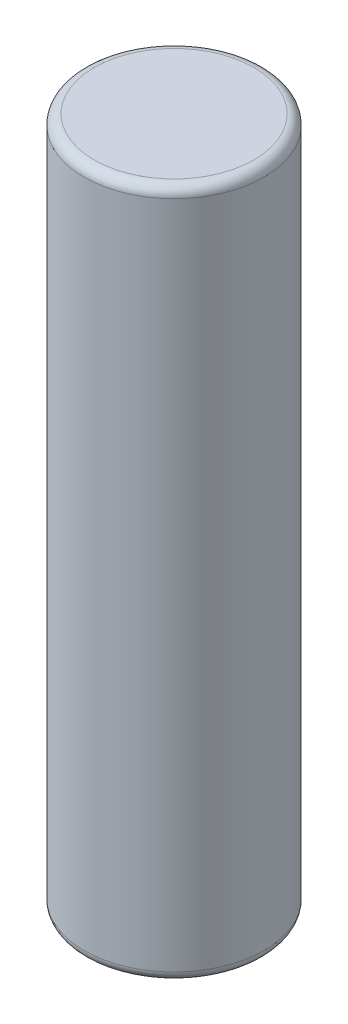
ISO-10303-21;
HEADER;
FILE_DESCRIPTION(('STEP AP214'),'2;1');
FILE_NAME('part.step','',(''),(''),'','','');
FILE_SCHEMA(('AUTOMOTIVE_DESIGN { 1 0 10303 214 1 1 1 1 }'));
ENDSEC;
DATA;
#1=APPLICATION_CONTEXT('core data for automotive mechanical design processes');
#2=APPLICATION_PROTOCOL_DEFINITION('international standard','automotive_design',2000,#1);
#3=PRODUCT_CONTEXT('',#1,'mechanical');
#4=PRODUCT('Part','Part','',(#3));
#5=PRODUCT_RELATED_PRODUCT_CATEGORY('part','',(#4));
#6=PRODUCT_DEFINITION_FORMATION('','',#4);
#7=PRODUCT_DEFINITION_CONTEXT('part definition',#1,'design');
#8=PRODUCT_DEFINITION('design','',#6,#7);
#9=PRODUCT_DEFINITION_SHAPE('','',#8);
#10=(LENGTH_UNIT() NAMED_UNIT(*) SI_UNIT(.MILLI.,.METRE.));
#11=(NAMED_UNIT(*) PLANE_ANGLE_UNIT() SI_UNIT($,.RADIAN.));
#12=(NAMED_UNIT(*) SI_UNIT($,.STERADIAN.) SOLID_ANGLE_UNIT());
#13=UNCERTAINTY_MEASURE_WITH_UNIT(LENGTH_MEASURE(1.E-05),#10,'distance_accuracy_value','');
#14=(GEOMETRIC_REPRESENTATION_CONTEXT(3) GLOBAL_UNCERTAINTY_ASSIGNED_CONTEXT((#13)) GLOBAL_UNIT_ASSIGNED_CONTEXT((#10,
#11,#12)) REPRESENTATION_CONTEXT('',''));
#15=CARTESIAN_POINT('',(0.,0.,0.));
#16=DIRECTION('',(0.,0.,1.));
#17=DIRECTION('',(1.,0.,0.));
#18=AXIS2_PLACEMENT_3D('',#15,#16,#17);
#19=CARTESIAN_POINT('',(0.,69.,0.));
#20=DIRECTION('',(0.,-1.,0.));
#21=DIRECTION('',(0.,0.,-1.));
#22=AXIS2_PLACEMENT_3D('',#19,#20,#21);
#23=CYLINDRICAL_SURFACE('',#22,9.);
#24=CARTESIAN_POINT('',(0.,1.,0.));
#25=DIRECTION('',(0.,1.,0.));
#26=DIRECTION('',(0.,0.,1.));
#27=AXIS2_PLACEMENT_3D('',#24,#25,#26);
#28=CIRCLE('',#27,9.);
#29=CARTESIAN_POINT('',(0.,1.,9.));
#30=VERTEX_POINT('',#29);
#31=EDGE_CURVE('E47',#30,#30,#28,.T.);
#32=ORIENTED_EDGE('',*,*,#31,.T.);
#33=EDGE_LOOP('',(#32));
#34=FACE_BOUND('',#33,.T.);
#35=CARTESIAN_POINT('',(0.,68.,0.));
#36=DIRECTION('',(0.,1.,0.));
#37=DIRECTION('',(0.,0.,1.));
#38=AXIS2_PLACEMENT_3D('',#35,#36,#37);
#39=CIRCLE('',#38,9.);
#40=CARTESIAN_POINT('',(0.,68.,9.));
#41=VERTEX_POINT('',#40);
#42=EDGE_CURVE('E51',#41,#41,#39,.F.);
#43=ORIENTED_EDGE('',*,*,#42,.T.);
#44=EDGE_LOOP('',(#43));
#45=FACE_BOUND('',#44,.T.);
#46=ADVANCED_FACE('F36',(#34,#45),#23,.T.);
#47=CARTESIAN_POINT('',(0.,69.,0.));
#48=DIRECTION('',(0.,1.,0.));
#49=DIRECTION('',(0.,0.,1.));
#50=AXIS2_PLACEMENT_3D('',#47,#48,#49);
#51=PLANE('',#50);
#52=CARTESIAN_POINT('',(0.,69.,0.));
#53=DIRECTION('',(0.,1.,0.));
#54=DIRECTION('',(0.,0.,1.));
#55=AXIS2_PLACEMENT_3D('',#52,#53,#54);
#56=CIRCLE('',#55,8.);
#57=CARTESIAN_POINT('',(0.,69.,8.));
#58=VERTEX_POINT('',#57);
#59=EDGE_CURVE('E10',#58,#58,#56,.T.);
#60=ORIENTED_EDGE('',*,*,#59,.T.);
#61=EDGE_LOOP('',(#60));
#62=FACE_BOUND('',#61,.T.);
#63=ADVANCED_FACE('F67',(#62),#51,.T.);
#64=CARTESIAN_POINT('',(0.,0.,0.));
#65=DIRECTION('',(0.,1.,0.));
#66=DIRECTION('',(0.,0.,1.));
#67=AXIS2_PLACEMENT_3D('',#64,#65,#66);
#68=PLANE('',#67);
#69=CARTESIAN_POINT('',(0.,0.,0.));
#70=DIRECTION('',(0.,1.,0.));
#71=DIRECTION('',(0.,0.,1.));
#72=AXIS2_PLACEMENT_3D('',#69,#70,#71);
#73=CIRCLE('',#72,8.);
#74=CARTESIAN_POINT('',(0.,0.,8.));
#75=VERTEX_POINT('',#74);
#76=EDGE_CURVE('E43',#75,#75,#73,.F.);
#77=ORIENTED_EDGE('',*,*,#76,.T.);
#78=EDGE_LOOP('',(#77));
#79=FACE_BOUND('',#78,.T.);
#80=ADVANCED_FACE('F64',(#79),#68,.F.);
#81=CARTESIAN_POINT('',(0.,1.,0.));
#82=DIRECTION('',(0.,1.,0.));
#83=DIRECTION('',(0.,0.,1.));
#84=AXIS2_PLACEMENT_3D('',#81,#82,#83);
#85=TOROIDAL_SURFACE('',#84,8.,1.);
#86=ORIENTED_EDGE('',*,*,#76,.F.);
#87=EDGE_LOOP('',(#86));
#88=FACE_BOUND('',#87,.T.);
#89=ORIENTED_EDGE('',*,*,#31,.F.);
#90=EDGE_LOOP('',(#89));
#91=FACE_BOUND('',#90,.T.);
#92=ADVANCED_FACE('F60',(#88,#91),#85,.T.);
#93=CARTESIAN_POINT('',(0.,68.,0.));
#94=DIRECTION('',(0.,1.,0.));
#95=DIRECTION('',(0.,0.,1.));
#96=AXIS2_PLACEMENT_3D('',#93,#94,#95);
#97=TOROIDAL_SURFACE('',#96,8.,1.);
#98=ORIENTED_EDGE('',*,*,#42,.F.);
#99=EDGE_LOOP('',(#98));
#100=FACE_BOUND('',#99,.T.);
#101=ORIENTED_EDGE('',*,*,#59,.F.);
#102=EDGE_LOOP('',(#101));
#103=FACE_BOUND('',#102,.T.);
#104=ADVANCED_FACE('F38',(#100,#103),#97,.T.);
#105=CLOSED_SHELL('',(#46,#63,#80,#92,#104));
#106=MANIFOLD_SOLID_BREP('B2',#105);
#107=ADVANCED_BREP_SHAPE_REPRESENTATION('',(#18,#106),#14);
#108=SHAPE_DEFINITION_REPRESENTATION(#9,#107);
ENDSEC;
END-ISO-10303-21;
